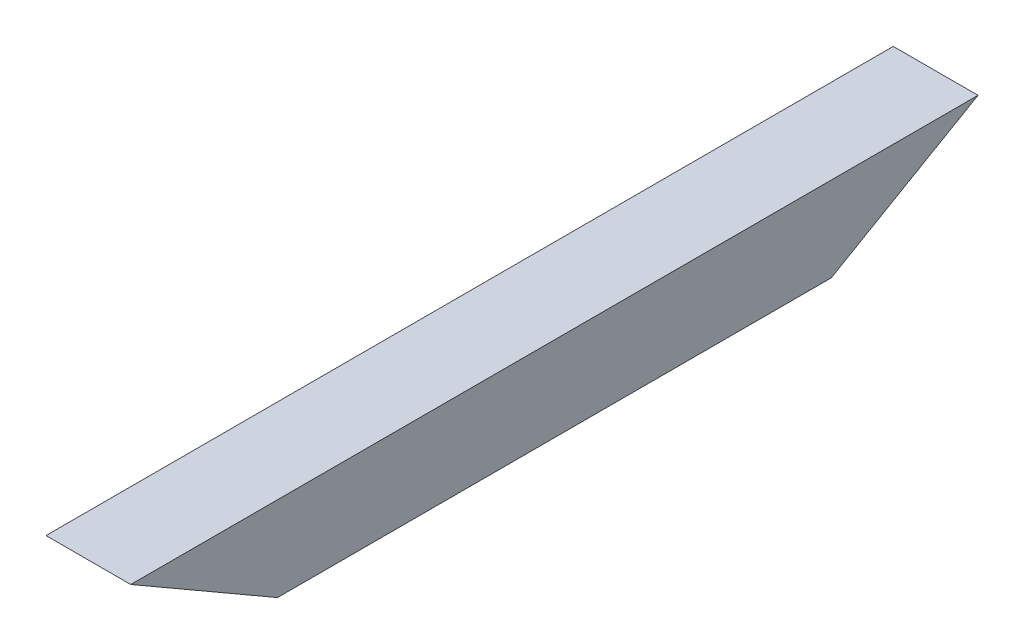
ISO-10303-21;
HEADER;
FILE_DESCRIPTION(('STEP AP214'),'2;1');
FILE_NAME('part.step','',(''),(''),'','','');
FILE_SCHEMA(('AUTOMOTIVE_DESIGN { 1 0 10303 214 1 1 1 1 }'));
ENDSEC;
DATA;
#1=APPLICATION_CONTEXT('core data for automotive mechanical design processes');
#2=APPLICATION_PROTOCOL_DEFINITION('international standard','automotive_design',2000,#1);
#3=PRODUCT_CONTEXT('',#1,'mechanical');
#4=PRODUCT('Part','Part','',(#3));
#5=PRODUCT_RELATED_PRODUCT_CATEGORY('part','',(#4));
#6=PRODUCT_DEFINITION_FORMATION('','',#4);
#7=PRODUCT_DEFINITION_CONTEXT('part definition',#1,'design');
#8=PRODUCT_DEFINITION('design','',#6,#7);
#9=PRODUCT_DEFINITION_SHAPE('','',#8);
#10=(LENGTH_UNIT() NAMED_UNIT(*) SI_UNIT(.MILLI.,.METRE.));
#11=(NAMED_UNIT(*) PLANE_ANGLE_UNIT() SI_UNIT($,.RADIAN.));
#12=(NAMED_UNIT(*) SI_UNIT($,.STERADIAN.) SOLID_ANGLE_UNIT());
#13=UNCERTAINTY_MEASURE_WITH_UNIT(LENGTH_MEASURE(1.E-05),#10,'distance_accuracy_value','');
#14=(GEOMETRIC_REPRESENTATION_CONTEXT(3) GLOBAL_UNCERTAINTY_ASSIGNED_CONTEXT((#13)) GLOBAL_UNIT_ASSIGNED_CONTEXT((#10,
#11,#12)) REPRESENTATION_CONTEXT('',''));
#15=CARTESIAN_POINT('',(0.,0.,0.));
#16=DIRECTION('',(0.,0.,1.));
#17=DIRECTION('',(1.,0.,0.));
#18=AXIS2_PLACEMENT_3D('',#15,#16,#17);
#19=CARTESIAN_POINT('',(25.4,-25.4,508.));
#20=DIRECTION('',(-1.,0.,0.));
#21=DIRECTION('',(0.,0.,1.));
#22=AXIS2_PLACEMENT_3D('',#19,#20,#21);
#23=PLANE('',#22);
#24=DIRECTION('',(0.,0.,-1.));
#25=VECTOR('',#24,1.);
#26=CARTESIAN_POINT('',(25.4,25.4,508.));
#27=LINE('',#26,#25);
#28=CARTESIAN_POINT('',(25.4,25.4,508.));
#29=VERTEX_POINT('',#28);
#30=CARTESIAN_POINT('',(25.4,25.4,0.));
#31=VERTEX_POINT('',#30);
#32=EDGE_CURVE('E108',#29,#31,#27,.T.);
#33=ORIENTED_EDGE('',*,*,#32,.F.);
#34=DIRECTION('',(0.,-0.499999999999995,-0.866025403784442));
#35=VECTOR('',#34,1.);
#36=CARTESIAN_POINT('',(25.4,25.4,508.));
#37=LINE('',#36,#35);
#38=CARTESIAN_POINT('',(25.4,-25.4,420.0118189755));
#39=VERTEX_POINT('',#38);
#40=EDGE_CURVE('E94',#29,#39,#37,.T.);
#41=ORIENTED_EDGE('',*,*,#40,.T.);
#42=DIRECTION('',(0.,0.,-1.));
#43=VECTOR('',#42,1.);
#44=CARTESIAN_POINT('',(25.4,-25.4,508.));
#45=LINE('',#44,#43);
#46=CARTESIAN_POINT('',(25.4,-25.4,87.988181024498));
#47=VERTEX_POINT('',#46);
#48=EDGE_CURVE('E111',#39,#47,#45,.T.);
#49=ORIENTED_EDGE('',*,*,#48,.T.);
#50=DIRECTION('',(0.,0.500000000000004,-0.866025403784436));
#51=VECTOR('',#50,1.);
#52=CARTESIAN_POINT('',(25.4,25.4,0.));
#53=LINE('',#52,#51);
#54=EDGE_CURVE('E116',#47,#31,#53,.T.);
#55=ORIENTED_EDGE('',*,*,#54,.T.);
#56=EDGE_LOOP('',(#33,#41,#49,#55));
#57=FACE_BOUND('',#56,.T.);
#58=ADVANCED_FACE('F33',(#57),#23,.F.);
#59=CARTESIAN_POINT('',(-25.4,25.4,508.));
#60=DIRECTION('',(0.,-1.,0.));
#61=DIRECTION('',(0.,0.,-1.));
#62=AXIS2_PLACEMENT_3D('',#59,#60,#61);
#63=PLANE('',#62);
#64=DIRECTION('',(-1.,0.,0.));
#65=VECTOR('',#64,1.);
#66=CARTESIAN_POINT('',(-25.4,25.4,0.));
#67=LINE('',#66,#65);
#68=CARTESIAN_POINT('',(-25.4,25.4,0.));
#69=VERTEX_POINT('',#68);
#70=EDGE_CURVE('E112',#31,#69,#67,.T.);
#71=ORIENTED_EDGE('',*,*,#70,.T.);
#72=DIRECTION('',(0.,0.,-1.));
#73=VECTOR('',#72,1.);
#74=CARTESIAN_POINT('',(-25.4,25.4,508.));
#75=LINE('',#74,#73);
#76=CARTESIAN_POINT('',(-25.4,25.4,508.));
#77=VERTEX_POINT('',#76);
#78=EDGE_CURVE('E110',#77,#69,#75,.T.);
#79=ORIENTED_EDGE('',*,*,#78,.F.);
#80=DIRECTION('',(-1.,0.,0.));
#81=VECTOR('',#80,1.);
#82=CARTESIAN_POINT('',(-25.4,25.4,508.));
#83=LINE('',#82,#81);
#84=EDGE_CURVE('E97',#29,#77,#83,.T.);
#85=ORIENTED_EDGE('',*,*,#84,.F.);
#86=ORIENTED_EDGE('',*,*,#32,.T.);
#87=EDGE_LOOP('',(#71,#79,#85,#86));
#88=FACE_BOUND('',#87,.T.);
#89=ADVANCED_FACE('F107',(#88),#63,.F.);
#90=CARTESIAN_POINT('',(-25.4,-25.4,508.));
#91=DIRECTION('',(1.,0.,0.));
#92=DIRECTION('',(0.,0.,-1.));
#93=AXIS2_PLACEMENT_3D('',#90,#91,#92);
#94=PLANE('',#93);
#95=DIRECTION('',(0.,0.,-1.));
#96=VECTOR('',#95,1.);
#97=CARTESIAN_POINT('',(-25.4,-25.4,508.));
#98=LINE('',#97,#96);
#99=CARTESIAN_POINT('',(-25.4,-25.4,420.0118189755));
#100=VERTEX_POINT('',#99);
#101=CARTESIAN_POINT('',(-25.4,-25.4,87.988181024498));
#102=VERTEX_POINT('',#101);
#103=EDGE_CURVE('E119',#100,#102,#98,.T.);
#104=ORIENTED_EDGE('',*,*,#103,.F.);
#105=DIRECTION('',(0.,-0.499999999999995,-0.866025403784442));
#106=VECTOR('',#105,1.);
#107=CARTESIAN_POINT('',(-25.4,25.4,508.));
#108=LINE('',#107,#106);
#109=EDGE_CURVE('E47',#77,#100,#108,.T.);
#110=ORIENTED_EDGE('',*,*,#109,.F.);
#111=ORIENTED_EDGE('',*,*,#78,.T.);
#112=DIRECTION('',(0.,0.500000000000004,-0.866025403784436));
#113=VECTOR('',#112,1.);
#114=CARTESIAN_POINT('',(-25.4,25.4,0.));
#115=LINE('',#114,#113);
#116=EDGE_CURVE('E145',#102,#69,#115,.T.);
#117=ORIENTED_EDGE('',*,*,#116,.F.);
#118=EDGE_LOOP('',(#104,#110,#111,#117));
#119=FACE_BOUND('',#118,.T.);
#120=ADVANCED_FACE('F160',(#119),#94,.F.);
#121=CARTESIAN_POINT('',(-25.4,-25.4,508.));
#122=DIRECTION('',(0.,1.,0.));
#123=DIRECTION('',(0.,0.,1.));
#124=AXIS2_PLACEMENT_3D('',#121,#122,#123);
#125=PLANE('',#124);
#126=ORIENTED_EDGE('',*,*,#48,.F.);
#127=DIRECTION('',(-1.,0.,0.));
#128=VECTOR('',#127,1.);
#129=CARTESIAN_POINT('',(25.4,-25.4,420.0118189755));
#130=LINE('',#129,#128);
#131=EDGE_CURVE('E98',#39,#100,#130,.T.);
#132=ORIENTED_EDGE('',*,*,#131,.T.);
#133=ORIENTED_EDGE('',*,*,#103,.T.);
#134=DIRECTION('',(-1.,0.,0.));
#135=VECTOR('',#134,1.);
#136=CARTESIAN_POINT('',(25.4,-25.4,87.988181024498));
#137=LINE('',#136,#135);
#138=EDGE_CURVE('E142',#47,#102,#137,.T.);
#139=ORIENTED_EDGE('',*,*,#138,.F.);
#140=EDGE_LOOP('',(#126,#132,#133,#139));
#141=FACE_BOUND('',#140,.T.);
#142=ADVANCED_FACE('F156',(#141),#125,.F.);
#143=CARTESIAN_POINT('',(22.225,-22.225,508.));
#144=DIRECTION('',(-1.,0.,0.));
#145=DIRECTION('',(0.,0.,1.));
#146=AXIS2_PLACEMENT_3D('',#143,#144,#145);
#147=PLANE('',#146);
#148=DIRECTION('',(0.,-0.499999999999995,-0.866025403784442));
#149=VECTOR('',#148,1.);
#150=CARTESIAN_POINT('',(22.225,13.4937500000002,487.377770072383));
#151=LINE('',#150,#149);
#152=CARTESIAN_POINT('',(22.225,22.225,502.500738685969));
#153=VERTEX_POINT('',#152);
#154=CARTESIAN_POINT('',(22.225,-22.225,425.511080289531));
#155=VERTEX_POINT('',#154);
#156=EDGE_CURVE('E54',#153,#155,#151,.T.);
#157=ORIENTED_EDGE('',*,*,#156,.F.);
#158=DIRECTION('',(0.,0.,-1.));
#159=VECTOR('',#158,1.);
#160=CARTESIAN_POINT('',(22.225,22.225,508.));
#161=LINE('',#160,#159);
#162=CARTESIAN_POINT('',(22.225,22.225,5.499261314031));
#163=VERTEX_POINT('',#162);
#164=EDGE_CURVE('E124',#153,#163,#161,.T.);
#165=ORIENTED_EDGE('',*,*,#164,.T.);
#166=DIRECTION('',(0.,0.500000000000004,-0.866025403784436));
#167=VECTOR('',#166,1.);
#168=CARTESIAN_POINT('',(22.225,-206.476702561249,401.622229927615));
#169=LINE('',#168,#167);
#170=CARTESIAN_POINT('',(22.225,-22.225,82.4889197104668));
#171=VERTEX_POINT('',#170);
#172=EDGE_CURVE('E133',#171,#163,#169,.T.);
#173=ORIENTED_EDGE('',*,*,#172,.F.);
#174=DIRECTION('',(0.,0.,-1.));
#175=VECTOR('',#174,1.);
#176=CARTESIAN_POINT('',(22.225,-22.225,508.));
#177=LINE('',#176,#175);
#178=EDGE_CURVE('E131',#155,#171,#177,.T.);
#179=ORIENTED_EDGE('',*,*,#178,.F.);
#180=EDGE_LOOP('',(#157,#165,#173,#179));
#181=FACE_BOUND('',#180,.T.);
#182=ADVANCED_FACE('F186',(#181),#147,.T.);
#183=CARTESIAN_POINT('',(-22.225,22.225,508.));
#184=DIRECTION('',(0.,-1.,0.));
#185=DIRECTION('',(0.,0.,-1.));
#186=AXIS2_PLACEMENT_3D('',#183,#184,#185);
#187=PLANE('',#186);
#188=DIRECTION('',(1.,0.,0.));
#189=VECTOR('',#188,1.);
#190=CARTESIAN_POINT('',(-22.225,22.225,502.500738685969));
#191=LINE('',#190,#189);
#192=CARTESIAN_POINT('',(-22.225,22.225,502.500738685969));
#193=VERTEX_POINT('',#192);
#194=EDGE_CURVE('E149',#193,#153,#191,.T.);
#195=ORIENTED_EDGE('',*,*,#194,.F.);
#196=DIRECTION('',(0.,0.,-1.));
#197=VECTOR('',#196,1.);
#198=CARTESIAN_POINT('',(-22.225,22.225,508.));
#199=LINE('',#198,#197);
#200=CARTESIAN_POINT('',(-22.225,22.225,5.49926131403111));
#201=VERTEX_POINT('',#200);
#202=EDGE_CURVE('E127',#193,#201,#199,.T.);
#203=ORIENTED_EDGE('',*,*,#202,.T.);
#204=DIRECTION('',(-1.,0.,0.));
#205=VECTOR('',#204,1.);
#206=CARTESIAN_POINT('',(-22.225,22.225,5.499261314031));
#207=LINE('',#206,#205);
#208=EDGE_CURVE('E136',#163,#201,#207,.T.);
#209=ORIENTED_EDGE('',*,*,#208,.F.);
#210=ORIENTED_EDGE('',*,*,#164,.F.);
#211=EDGE_LOOP('',(#195,#203,#209,#210));
#212=FACE_BOUND('',#211,.T.);
#213=ADVANCED_FACE('F189',(#212),#187,.T.);
#214=CARTESIAN_POINT('',(-22.225,-22.225,508.));
#215=DIRECTION('',(1.,0.,0.));
#216=DIRECTION('',(0.,0.,-1.));
#217=AXIS2_PLACEMENT_3D('',#214,#215,#216);
#218=PLANE('',#217);
#219=DIRECTION('',(0.,0.499999999999995,0.866025403784442));
#220=VECTOR('',#219,1.);
#221=CARTESIAN_POINT('',(-22.225,13.4937500000002,487.377770072383));
#222=LINE('',#221,#220);
#223=CARTESIAN_POINT('',(-22.225,-22.225,425.511080289531));
#224=VERTEX_POINT('',#223);
#225=EDGE_CURVE('E151',#224,#193,#222,.T.);
#226=ORIENTED_EDGE('',*,*,#225,.F.);
#227=DIRECTION('',(0.,0.,-1.));
#228=VECTOR('',#227,1.);
#229=CARTESIAN_POINT('',(-22.225,-22.225,508.));
#230=LINE('',#229,#228);
#231=CARTESIAN_POINT('',(-22.225,-22.225,82.4889197104668));
#232=VERTEX_POINT('',#231);
#233=EDGE_CURVE('E129',#224,#232,#230,.T.);
#234=ORIENTED_EDGE('',*,*,#233,.T.);
#235=DIRECTION('',(0.,-0.500000000000004,0.866025403784436));
#236=VECTOR('',#235,1.);
#237=CARTESIAN_POINT('',(-22.225,-206.476702561249,401.622229927615));
#238=LINE('',#237,#236);
#239=EDGE_CURVE('E139',#201,#232,#238,.T.);
#240=ORIENTED_EDGE('',*,*,#239,.F.);
#241=ORIENTED_EDGE('',*,*,#202,.F.);
#242=EDGE_LOOP('',(#226,#234,#240,#241));
#243=FACE_BOUND('',#242,.T.);
#244=ADVANCED_FACE('F172',(#243),#218,.T.);
#245=CARTESIAN_POINT('',(-22.225,-22.225,508.));
#246=DIRECTION('',(0.,1.,0.));
#247=DIRECTION('',(0.,0.,1.));
#248=AXIS2_PLACEMENT_3D('',#245,#246,#247);
#249=PLANE('',#248);
#250=DIRECTION('',(-1.,0.,0.));
#251=VECTOR('',#250,1.);
#252=CARTESIAN_POINT('',(-22.225,-22.225,425.511080289531));
#253=LINE('',#252,#251);
#254=EDGE_CURVE('E11',#155,#224,#253,.T.);
#255=ORIENTED_EDGE('',*,*,#254,.F.);
#256=ORIENTED_EDGE('',*,*,#178,.T.);
#257=DIRECTION('',(1.,0.,0.));
#258=VECTOR('',#257,1.);
#259=CARTESIAN_POINT('',(-22.225,-22.225,82.4889197104668));
#260=LINE('',#259,#258);
#261=EDGE_CURVE('E40',#232,#171,#260,.T.);
#262=ORIENTED_EDGE('',*,*,#261,.F.);
#263=ORIENTED_EDGE('',*,*,#233,.F.);
#264=EDGE_LOOP('',(#255,#256,#262,#263));
#265=FACE_BOUND('',#264,.T.);
#266=ADVANCED_FACE('F164',(#265),#249,.T.);
#267=CARTESIAN_POINT('',(25.4,25.4,0.));
#268=DIRECTION('',(0.,0.866025403784436,0.500000000000004));
#269=DIRECTION('',(0.,-0.500000000000004,0.866025403784436));
#270=AXIS2_PLACEMENT_3D('',#267,#268,#269);
#271=PLANE('',#270);
#272=ORIENTED_EDGE('',*,*,#172,.T.);
#273=ORIENTED_EDGE('',*,*,#208,.T.);
#274=ORIENTED_EDGE('',*,*,#239,.T.);
#275=ORIENTED_EDGE('',*,*,#261,.T.);
#276=EDGE_LOOP('',(#272,#273,#274,#275));
#277=FACE_BOUND('',#276,.T.);
#278=ORIENTED_EDGE('',*,*,#116,.T.);
#279=ORIENTED_EDGE('',*,*,#70,.F.);
#280=ORIENTED_EDGE('',*,*,#54,.F.);
#281=ORIENTED_EDGE('',*,*,#138,.T.);
#282=EDGE_LOOP('',(#278,#279,#280,#281));
#283=FACE_BOUND('',#282,.T.);
#284=ADVANCED_FACE('F162',(#277,#283),#271,.F.);
#285=CARTESIAN_POINT('',(25.4,25.4,508.));
#286=DIRECTION('',(0.,0.866025403784441,-0.499999999999995));
#287=DIRECTION('',(0.,0.499999999999995,0.866025403784442));
#288=AXIS2_PLACEMENT_3D('',#285,#286,#287);
#289=PLANE('',#288);
#290=ORIENTED_EDGE('',*,*,#156,.T.);
#291=ORIENTED_EDGE('',*,*,#254,.T.);
#292=ORIENTED_EDGE('',*,*,#225,.T.);
#293=ORIENTED_EDGE('',*,*,#194,.T.);
#294=EDGE_LOOP('',(#290,#291,#292,#293));
#295=FACE_BOUND('',#294,.T.);
#296=ORIENTED_EDGE('',*,*,#109,.T.);
#297=ORIENTED_EDGE('',*,*,#131,.F.);
#298=ORIENTED_EDGE('',*,*,#40,.F.);
#299=ORIENTED_EDGE('',*,*,#84,.T.);
#300=EDGE_LOOP('',(#296,#297,#298,#299));
#301=FACE_BOUND('',#300,.T.);
#302=ADVANCED_FACE('F96',(#295,#301),#289,.F.);
#303=CLOSED_SHELL('',(#58,#89,#120,#142,#182,#213,#244,#266,#284,#302));
#304=MANIFOLD_SOLID_BREP('B2',#303);
#305=ADVANCED_BREP_SHAPE_REPRESENTATION('',(#18,#304),#14);
#306=SHAPE_DEFINITION_REPRESENTATION(#9,#305);
ENDSEC;
END-ISO-10303-21;
